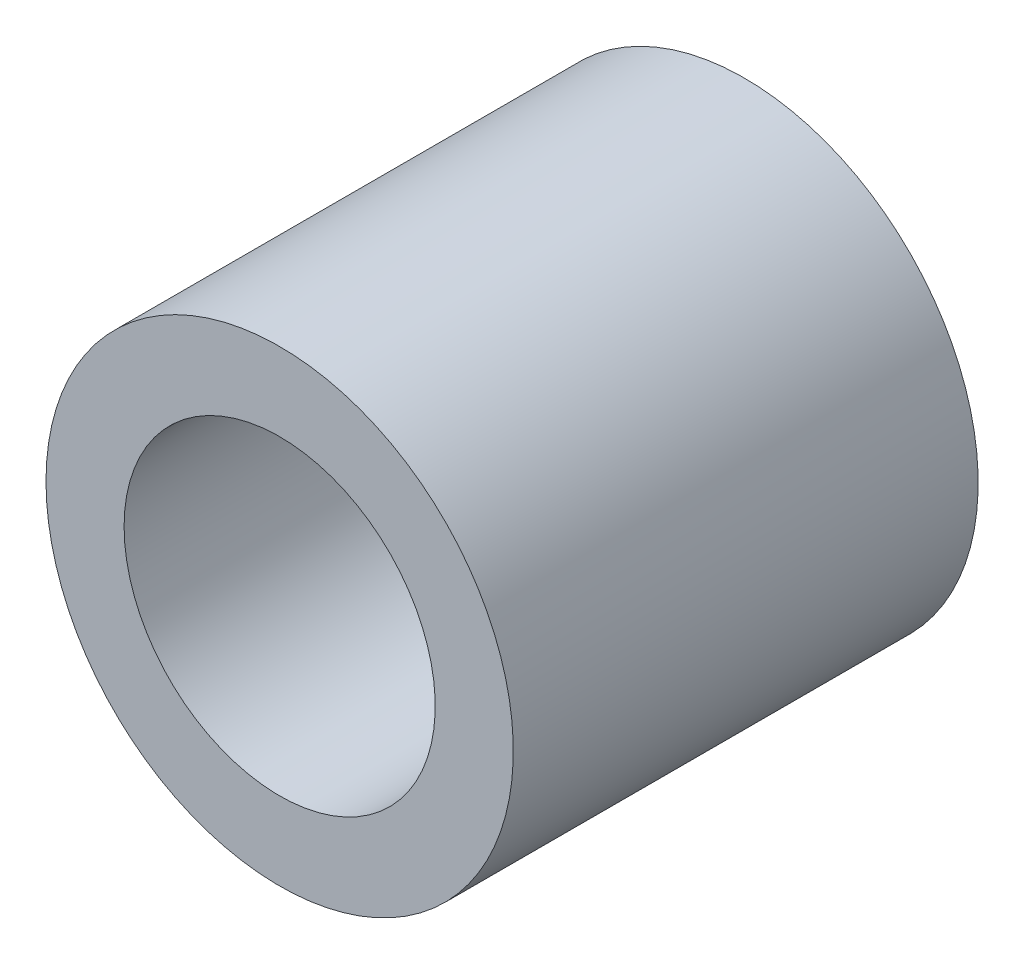
ISO-10303-21;
HEADER;
FILE_DESCRIPTION(('STEP AP214'),'2;1');
FILE_NAME('part.step','',(''),(''),'','','');
FILE_SCHEMA(('AUTOMOTIVE_DESIGN { 1 0 10303 214 1 1 1 1 }'));
ENDSEC;
DATA;
#1=APPLICATION_CONTEXT('core data for automotive mechanical design processes');
#2=APPLICATION_PROTOCOL_DEFINITION('international standard','automotive_design',2000,#1);
#3=PRODUCT_CONTEXT('',#1,'mechanical');
#4=PRODUCT('Part','Part','',(#3));
#5=PRODUCT_RELATED_PRODUCT_CATEGORY('part','',(#4));
#6=PRODUCT_DEFINITION_FORMATION('','',#4);
#7=PRODUCT_DEFINITION_CONTEXT('part definition',#1,'design');
#8=PRODUCT_DEFINITION('design','',#6,#7);
#9=PRODUCT_DEFINITION_SHAPE('','',#8);
#10=(LENGTH_UNIT() NAMED_UNIT(*) SI_UNIT(.MILLI.,.METRE.));
#11=(NAMED_UNIT(*) PLANE_ANGLE_UNIT() SI_UNIT($,.RADIAN.));
#12=(NAMED_UNIT(*) SI_UNIT($,.STERADIAN.) SOLID_ANGLE_UNIT());
#13=UNCERTAINTY_MEASURE_WITH_UNIT(LENGTH_MEASURE(1.E-05),#10,'distance_accuracy_value','');
#14=(GEOMETRIC_REPRESENTATION_CONTEXT(3) GLOBAL_UNCERTAINTY_ASSIGNED_CONTEXT((#13)) GLOBAL_UNIT_ASSIGNED_CONTEXT((#10,
#11,#12)) REPRESENTATION_CONTEXT('',''));
#15=CARTESIAN_POINT('',(0.,0.,0.));
#16=DIRECTION('',(0.,0.,1.));
#17=DIRECTION('',(1.,0.,0.));
#18=AXIS2_PLACEMENT_3D('',#15,#16,#17);
#19=CARTESIAN_POINT('',(0.,0.,4.7625));
#20=DIRECTION('',(0.,0.,1.));
#21=DIRECTION('',(1.,0.,0.));
#22=AXIS2_PLACEMENT_3D('',#19,#20,#21);
#23=PLANE('',#22);
#24=CARTESIAN_POINT('',(0.,0.,4.7625));
#25=DIRECTION('',(0.,0.,1.));
#26=DIRECTION('',(1.,0.,0.));
#27=AXIS2_PLACEMENT_3D('',#24,#25,#26);
#28=CIRCLE('',#27,4.7879);
#29=CARTESIAN_POINT('',(-4.7879,0.,4.7625));
#30=VERTEX_POINT('',#29);
#31=EDGE_CURVE('E10',#30,#30,#28,.T.);
#32=ORIENTED_EDGE('',*,*,#31,.T.);
#33=EDGE_LOOP('',(#32));
#34=FACE_BOUND('',#33,.T.);
#35=CARTESIAN_POINT('',(0.,0.,4.7625));
#36=DIRECTION('',(0.,0.,1.));
#37=DIRECTION('',(1.,0.,0.));
#38=AXIS2_PLACEMENT_3D('',#35,#36,#37);
#39=CIRCLE('',#38,3.1877);
#40=CARTESIAN_POINT('',(-3.1877,0.,4.7625));
#41=VERTEX_POINT('',#40);
#42=EDGE_CURVE('E41',#41,#41,#39,.T.);
#43=ORIENTED_EDGE('',*,*,#42,.F.);
#44=EDGE_LOOP('',(#43));
#45=FACE_BOUND('',#44,.T.);
#46=ADVANCED_FACE('F30',(#34,#45),#23,.T.);
#47=CARTESIAN_POINT('',(0.,0.,-4.7625));
#48=DIRECTION('',(0.,0.,1.));
#49=DIRECTION('',(1.,0.,0.));
#50=AXIS2_PLACEMENT_3D('',#47,#48,#49);
#51=PLANE('',#50);
#52=CARTESIAN_POINT('',(0.,0.,-4.7625));
#53=DIRECTION('',(0.,0.,1.));
#54=DIRECTION('',(1.,0.,0.));
#55=AXIS2_PLACEMENT_3D('',#52,#53,#54);
#56=CIRCLE('',#55,4.7879);
#57=CARTESIAN_POINT('',(-4.7879,0.,-4.7625));
#58=VERTEX_POINT('',#57);
#59=EDGE_CURVE('E34',#58,#58,#56,.T.);
#60=ORIENTED_EDGE('',*,*,#59,.F.);
#61=EDGE_LOOP('',(#60));
#62=FACE_BOUND('',#61,.T.);
#63=CARTESIAN_POINT('',(0.,0.,-4.7625));
#64=DIRECTION('',(0.,0.,1.));
#65=DIRECTION('',(1.,0.,0.));
#66=AXIS2_PLACEMENT_3D('',#63,#64,#65);
#67=CIRCLE('',#66,3.1877);
#68=CARTESIAN_POINT('',(-3.1877,0.,-4.7625));
#69=VERTEX_POINT('',#68);
#70=EDGE_CURVE('E43',#69,#69,#67,.T.);
#71=ORIENTED_EDGE('',*,*,#70,.T.);
#72=EDGE_LOOP('',(#71));
#73=FACE_BOUND('',#72,.T.);
#74=ADVANCED_FACE('F53',(#62,#73),#51,.F.);
#75=CARTESIAN_POINT('',(0.,0.,4.7625));
#76=DIRECTION('',(0.,0.,-1.));
#77=DIRECTION('',(-1.,0.,0.));
#78=AXIS2_PLACEMENT_3D('',#75,#76,#77);
#79=CYLINDRICAL_SURFACE('',#78,4.7879);
#80=CARTESIAN_POINT('',(-4.7879,0.,4.7625));
#81=CARTESIAN_POINT('',(-4.7879,0.,4.66328125));
#82=CARTESIAN_POINT('',(-4.7879,0.,4.5640625));
#83=CARTESIAN_POINT('',(-4.7879,0.,4.365625));
#84=CARTESIAN_POINT('',(-4.7879,0.,4.26640625));
#85=CARTESIAN_POINT('',(-4.7879,0.,4.06796875));
#86=CARTESIAN_POINT('',(-4.7879,0.,3.96875));
#87=CARTESIAN_POINT('',(-4.7879,0.,3.7703125));
#88=CARTESIAN_POINT('',(-4.7879,0.,3.67109375));
#89=CARTESIAN_POINT('',(-4.7879,0.,3.47265625));
#90=CARTESIAN_POINT('',(-4.7879,0.,3.3734375));
#91=CARTESIAN_POINT('',(-4.7879,0.,3.175));
#92=CARTESIAN_POINT('',(-4.7879,0.,3.07578125));
#93=CARTESIAN_POINT('',(-4.7879,0.,2.87734375));
#94=CARTESIAN_POINT('',(-4.7879,0.,2.778125));
#95=CARTESIAN_POINT('',(-4.7879,0.,2.5796875));
#96=CARTESIAN_POINT('',(-4.7879,0.,2.48046875));
#97=CARTESIAN_POINT('',(-4.7879,0.,2.28203125));
#98=CARTESIAN_POINT('',(-4.7879,0.,2.1828125));
#99=CARTESIAN_POINT('',(-4.7879,0.,1.984375));
#100=CARTESIAN_POINT('',(-4.7879,0.,1.88515625));
#101=CARTESIAN_POINT('',(-4.7879,0.,1.68671875));
#102=CARTESIAN_POINT('',(-4.7879,0.,1.5875));
#103=CARTESIAN_POINT('',(-4.7879,0.,1.3890625));
#104=CARTESIAN_POINT('',(-4.7879,0.,1.28984375));
#105=CARTESIAN_POINT('',(-4.7879,0.,1.09140625));
#106=CARTESIAN_POINT('',(-4.7879,0.,0.992187499999999));
#107=CARTESIAN_POINT('',(-4.7879,0.,0.793749999999999));
#108=CARTESIAN_POINT('',(-4.7879,0.,0.694531249999999));
#109=CARTESIAN_POINT('',(-4.7879,0.,0.496093749999999));
#110=CARTESIAN_POINT('',(-4.7879,0.,0.396874999999999));
#111=CARTESIAN_POINT('',(-4.7879,0.,0.198437499999999));
#112=CARTESIAN_POINT('',(-4.7879,0.,0.0992187499999992));
#113=CARTESIAN_POINT('',(-4.7879,0.,-0.0992187500000009));
#114=CARTESIAN_POINT('',(-4.7879,0.,-0.198437500000001));
#115=CARTESIAN_POINT('',(-4.7879,0.,-0.396875000000001));
#116=CARTESIAN_POINT('',(-4.7879,0.,-0.496093750000001));
#117=CARTESIAN_POINT('',(-4.7879,0.,-0.694531250000001));
#118=CARTESIAN_POINT('',(-4.7879,0.,-0.793750000000001));
#119=CARTESIAN_POINT('',(-4.7879,0.,-0.992187500000002));
#120=CARTESIAN_POINT('',(-4.7879,0.,-1.09140625));
#121=CARTESIAN_POINT('',(-4.7879,0.,-1.28984375));
#122=CARTESIAN_POINT('',(-4.7879,0.,-1.3890625));
#123=CARTESIAN_POINT('',(-4.7879,0.,-1.5875));
#124=CARTESIAN_POINT('',(-4.7879,0.,-1.68671875));
#125=CARTESIAN_POINT('',(-4.7879,0.,-1.88515625));
#126=CARTESIAN_POINT('',(-4.7879,0.,-1.984375));
#127=CARTESIAN_POINT('',(-4.7879,0.,-2.1828125));
#128=CARTESIAN_POINT('',(-4.7879,0.,-2.28203125));
#129=CARTESIAN_POINT('',(-4.7879,0.,-2.48046875));
#130=CARTESIAN_POINT('',(-4.7879,0.,-2.5796875));
#131=CARTESIAN_POINT('',(-4.7879,0.,-2.778125));
#132=CARTESIAN_POINT('',(-4.7879,0.,-2.87734375));
#133=CARTESIAN_POINT('',(-4.7879,0.,-3.07578125));
#134=CARTESIAN_POINT('',(-4.7879,0.,-3.175));
#135=CARTESIAN_POINT('',(-4.7879,0.,-3.3734375));
#136=CARTESIAN_POINT('',(-4.7879,0.,-3.47265625));
#137=CARTESIAN_POINT('',(-4.7879,0.,-3.67109375));
#138=CARTESIAN_POINT('',(-4.7879,0.,-3.7703125));
#139=CARTESIAN_POINT('',(-4.7879,0.,-3.96875));
#140=CARTESIAN_POINT('',(-4.7879,0.,-4.06796875));
#141=CARTESIAN_POINT('',(-4.7879,0.,-4.26640625));
#142=CARTESIAN_POINT('',(-4.7879,0.,-4.365625));
#143=CARTESIAN_POINT('',(-4.7879,0.,-4.5640625));
#144=CARTESIAN_POINT('',(-4.7879,0.,-4.66328125));
#145=CARTESIAN_POINT('',(-4.7879,0.,-4.7625));
#146=B_SPLINE_CURVE_WITH_KNOTS('',3,(#80,#81,#82,#83,#84,#85,#86,#87,#88,#89,#90,#91,#92,#93,
#94,#95,#96,#97,#98,#99,#100,#101,#102,#103,#104,#105,#106,#107,#108,#109,#110,#111,#112,#113,
#114,#115,#116,#117,#118,#119,#120,#121,#122,#123,#124,#125,#126,#127,#128,#129,#130,#131,#132,
#133,#134,#135,#136,#137,#138,#139,#140,#141,#142,#143,#144,#145),.UNSPECIFIED.,.F.,.F.,(4,2,2,
2,2,2,2,2,2,2,2,2,2,2,2,2,2,2,2,2,2,2,2,2,2,2,2,2,2,2,2,2,4),(0.,0.297656249999999,
0.595312499999999,0.89296875,1.190625,1.48828125,1.7859375,2.08359375,2.38125,2.67890625,
2.9765625,3.27421875,3.571875,3.86953125,4.1671875,4.46484375,4.7625,5.06015625,5.3578125,
5.65546875,5.953125,6.25078125,6.5484375,6.84609375,7.14375,7.44140625,7.7390625,8.03671875,
8.334375,8.63203125,8.9296875,9.22734375,9.525),.UNSPECIFIED.);
#147=EDGE_CURVE('BSEAM32',#30,#58,#146,.T.);
#148=ORIENTED_EDGE('',*,*,#31,.F.);
#149=ORIENTED_EDGE('',*,*,#59,.T.);
#150=ORIENTED_EDGE('',*,*,#147,.T.);
#151=ORIENTED_EDGE('',*,*,#147,.F.);
#152=EDGE_LOOP('',(#148,#150,#149,#151));
#153=FACE_BOUND('',#152,.T.);
#154=ADVANCED_FACE('F32',(#153),#79,.T.);
#155=CARTESIAN_POINT('',(0.,0.,4.7625));
#156=DIRECTION('',(0.,0.,-1.));
#157=DIRECTION('',(-1.,0.,0.));
#158=AXIS2_PLACEMENT_3D('',#155,#156,#157);
#159=CYLINDRICAL_SURFACE('',#158,3.1877);
#160=CARTESIAN_POINT('',(-3.1877,0.,4.7625));
#161=CARTESIAN_POINT('',(-3.1877,0.,4.66328125));
#162=CARTESIAN_POINT('',(-3.1877,0.,4.5640625));
#163=CARTESIAN_POINT('',(-3.1877,0.,4.365625));
#164=CARTESIAN_POINT('',(-3.1877,0.,4.26640625));
#165=CARTESIAN_POINT('',(-3.1877,0.,4.06796875));
#166=CARTESIAN_POINT('',(-3.1877,0.,3.96875));
#167=CARTESIAN_POINT('',(-3.1877,0.,3.7703125));
#168=CARTESIAN_POINT('',(-3.1877,0.,3.67109375));
#169=CARTESIAN_POINT('',(-3.1877,0.,3.47265625));
#170=CARTESIAN_POINT('',(-3.1877,0.,3.3734375));
#171=CARTESIAN_POINT('',(-3.1877,0.,3.175));
#172=CARTESIAN_POINT('',(-3.1877,0.,3.07578125));
#173=CARTESIAN_POINT('',(-3.1877,0.,2.87734375));
#174=CARTESIAN_POINT('',(-3.1877,0.,2.778125));
#175=CARTESIAN_POINT('',(-3.1877,0.,2.5796875));
#176=CARTESIAN_POINT('',(-3.1877,0.,2.48046875));
#177=CARTESIAN_POINT('',(-3.1877,0.,2.28203125));
#178=CARTESIAN_POINT('',(-3.1877,0.,2.1828125));
#179=CARTESIAN_POINT('',(-3.1877,0.,1.984375));
#180=CARTESIAN_POINT('',(-3.1877,0.,1.88515625));
#181=CARTESIAN_POINT('',(-3.1877,0.,1.68671875));
#182=CARTESIAN_POINT('',(-3.1877,0.,1.5875));
#183=CARTESIAN_POINT('',(-3.1877,0.,1.3890625));
#184=CARTESIAN_POINT('',(-3.1877,0.,1.28984375));
#185=CARTESIAN_POINT('',(-3.1877,0.,1.09140625));
#186=CARTESIAN_POINT('',(-3.1877,0.,0.992187499999999));
#187=CARTESIAN_POINT('',(-3.1877,0.,0.793749999999999));
#188=CARTESIAN_POINT('',(-3.1877,0.,0.694531249999999));
#189=CARTESIAN_POINT('',(-3.1877,0.,0.496093749999999));
#190=CARTESIAN_POINT('',(-3.1877,0.,0.396874999999999));
#191=CARTESIAN_POINT('',(-3.1877,0.,0.198437499999999));
#192=CARTESIAN_POINT('',(-3.1877,0.,0.0992187499999992));
#193=CARTESIAN_POINT('',(-3.1877,0.,-0.0992187500000009));
#194=CARTESIAN_POINT('',(-3.1877,0.,-0.198437500000001));
#195=CARTESIAN_POINT('',(-3.1877,0.,-0.396875000000001));
#196=CARTESIAN_POINT('',(-3.1877,0.,-0.496093750000001));
#197=CARTESIAN_POINT('',(-3.1877,0.,-0.694531250000001));
#198=CARTESIAN_POINT('',(-3.1877,0.,-0.793750000000001));
#199=CARTESIAN_POINT('',(-3.1877,0.,-0.992187500000002));
#200=CARTESIAN_POINT('',(-3.1877,0.,-1.09140625));
#201=CARTESIAN_POINT('',(-3.1877,0.,-1.28984375));
#202=CARTESIAN_POINT('',(-3.1877,0.,-1.3890625));
#203=CARTESIAN_POINT('',(-3.1877,0.,-1.5875));
#204=CARTESIAN_POINT('',(-3.1877,0.,-1.68671875));
#205=CARTESIAN_POINT('',(-3.1877,0.,-1.88515625));
#206=CARTESIAN_POINT('',(-3.1877,0.,-1.984375));
#207=CARTESIAN_POINT('',(-3.1877,0.,-2.1828125));
#208=CARTESIAN_POINT('',(-3.1877,0.,-2.28203125));
#209=CARTESIAN_POINT('',(-3.1877,0.,-2.48046875));
#210=CARTESIAN_POINT('',(-3.1877,0.,-2.5796875));
#211=CARTESIAN_POINT('',(-3.1877,0.,-2.778125));
#212=CARTESIAN_POINT('',(-3.1877,0.,-2.87734375));
#213=CARTESIAN_POINT('',(-3.1877,0.,-3.07578125));
#214=CARTESIAN_POINT('',(-3.1877,0.,-3.175));
#215=CARTESIAN_POINT('',(-3.1877,0.,-3.3734375));
#216=CARTESIAN_POINT('',(-3.1877,0.,-3.47265625));
#217=CARTESIAN_POINT('',(-3.1877,0.,-3.67109375));
#218=CARTESIAN_POINT('',(-3.1877,0.,-3.7703125));
#219=CARTESIAN_POINT('',(-3.1877,0.,-3.96875));
#220=CARTESIAN_POINT('',(-3.1877,0.,-4.06796875));
#221=CARTESIAN_POINT('',(-3.1877,0.,-4.26640625));
#222=CARTESIAN_POINT('',(-3.1877,0.,-4.365625));
#223=CARTESIAN_POINT('',(-3.1877,0.,-4.5640625));
#224=CARTESIAN_POINT('',(-3.1877,0.,-4.66328125));
#225=CARTESIAN_POINT('',(-3.1877,0.,-4.7625));
#226=B_SPLINE_CURVE_WITH_KNOTS('',3,(#160,#161,#162,#163,#164,#165,#166,#167,#168,#169,#170,
#171,#172,#173,#174,#175,#176,#177,#178,#179,#180,#181,#182,#183,#184,#185,#186,#187,#188,#189,
#190,#191,#192,#193,#194,#195,#196,#197,#198,#199,#200,#201,#202,#203,#204,#205,#206,#207,#208,
#209,#210,#211,#212,#213,#214,#215,#216,#217,#218,#219,#220,#221,#222,#223,#224,#225),
.UNSPECIFIED.,.F.,.F.,(4,2,2,2,2,2,2,2,2,2,2,2,2,2,2,2,2,2,2,2,2,2,2,2,2,2,2,2,2,2,2,2,4),(0.,
0.297656249999999,0.595312499999999,0.89296875,1.190625,1.48828125,1.7859375,2.08359375,2.38125,
2.67890625,2.9765625,3.27421875,3.571875,3.86953125,4.1671875,4.46484375,4.7625,5.06015625,
5.3578125,5.65546875,5.953125,6.25078125,6.5484375,6.84609375,7.14375,7.44140625,7.7390625,
8.03671875,8.334375,8.63203125,8.9296875,9.22734375,9.525),.UNSPECIFIED.);
#227=EDGE_CURVE('BSEAM49',#41,#69,#226,.T.);
#228=ORIENTED_EDGE('',*,*,#42,.T.);
#229=ORIENTED_EDGE('',*,*,#70,.F.);
#230=ORIENTED_EDGE('',*,*,#227,.T.);
#231=ORIENTED_EDGE('',*,*,#227,.F.);
#232=EDGE_LOOP('',(#228,#230,#229,#231));
#233=FACE_BOUND('',#232,.T.);
#234=ADVANCED_FACE('F49',(#233),#159,.F.);
#235=CLOSED_SHELL('',(#46,#74,#154,#234));
#236=MANIFOLD_SOLID_BREP('B2',#235);
#237=ADVANCED_BREP_SHAPE_REPRESENTATION('',(#18,#236),#14);
#238=SHAPE_DEFINITION_REPRESENTATION(#9,#237);
ENDSEC;
END-ISO-10303-21;
